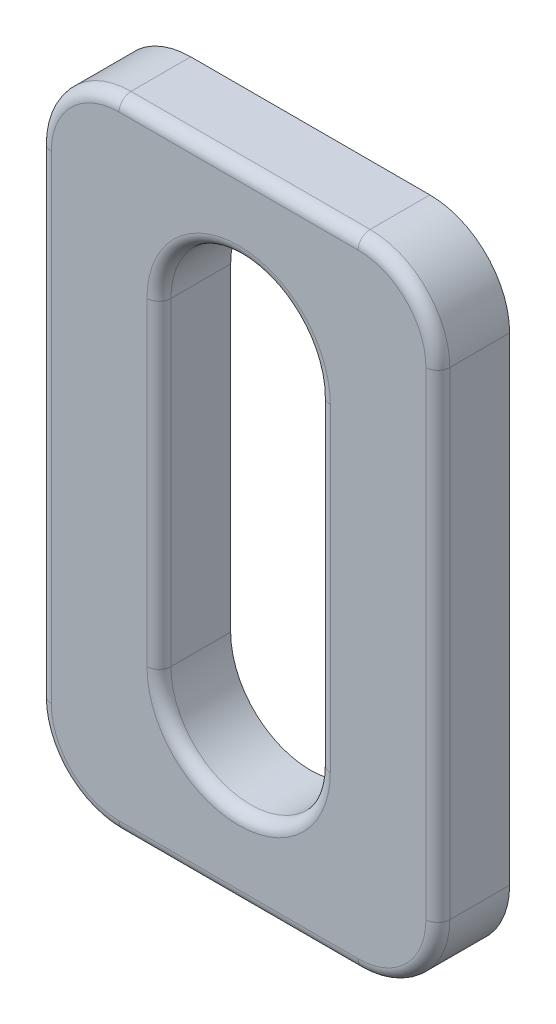
ISO-10303-21;
HEADER;
FILE_DESCRIPTION(('STEP AP214'),'2;1');
FILE_NAME('part.step','',(''),(''),'','','');
FILE_SCHEMA(('AUTOMOTIVE_DESIGN { 1 0 10303 214 1 1 1 1 }'));
ENDSEC;
DATA;
#1=APPLICATION_CONTEXT('core data for automotive mechanical design processes');
#2=APPLICATION_PROTOCOL_DEFINITION('international standard','automotive_design',2000,#1);
#3=PRODUCT_CONTEXT('',#1,'mechanical');
#4=PRODUCT('Part','Part','',(#3));
#5=PRODUCT_RELATED_PRODUCT_CATEGORY('part','',(#4));
#6=PRODUCT_DEFINITION_FORMATION('','',#4);
#7=PRODUCT_DEFINITION_CONTEXT('part definition',#1,'design');
#8=PRODUCT_DEFINITION('design','',#6,#7);
#9=PRODUCT_DEFINITION_SHAPE('','',#8);
#10=(LENGTH_UNIT() NAMED_UNIT(*) SI_UNIT(.MILLI.,.METRE.));
#11=(NAMED_UNIT(*) PLANE_ANGLE_UNIT() SI_UNIT($,.RADIAN.));
#12=(NAMED_UNIT(*) SI_UNIT($,.STERADIAN.) SOLID_ANGLE_UNIT());
#13=UNCERTAINTY_MEASURE_WITH_UNIT(LENGTH_MEASURE(1.E-05),#10,'distance_accuracy_value','');
#14=(GEOMETRIC_REPRESENTATION_CONTEXT(3) GLOBAL_UNCERTAINTY_ASSIGNED_CONTEXT((#13)) GLOBAL_UNIT_ASSIGNED_CONTEXT((#10,
#11,#12)) REPRESENTATION_CONTEXT('',''));
#15=CARTESIAN_POINT('',(0.,0.,0.));
#16=DIRECTION('',(0.,0.,1.));
#17=DIRECTION('',(1.,0.,0.));
#18=AXIS2_PLACEMENT_3D('',#15,#16,#17);
#19=CARTESIAN_POINT('',(0.,0.,4.5));
#20=DIRECTION('',(0.,0.,-1.));
#21=DIRECTION('',(-1.,0.,0.));
#22=AXIS2_PLACEMENT_3D('',#19,#20,#21);
#23=PLANE('',#22);
#24=CARTESIAN_POINT('',(5.,35.,4.5));
#25=DIRECTION('',(0.,0.,-1.));
#26=DIRECTION('',(-1.,0.,0.));
#27=AXIS2_PLACEMENT_3D('',#24,#25,#26);
#28=CIRCLE('',#27,4.25);
#29=CARTESIAN_POINT('',(5.,39.25,4.5));
#30=VERTEX_POINT('',#29);
#31=CARTESIAN_POINT('',(0.75,35.,4.5));
#32=VERTEX_POINT('',#31);
#33=EDGE_CURVE('E256',#30,#32,#28,.F.);
#34=ORIENTED_EDGE('',*,*,#33,.T.);
#35=DIRECTION('',(0.,-1.,0.));
#36=VECTOR('',#35,1.);
#37=CARTESIAN_POINT('',(0.75,0.,4.5));
#38=LINE('',#37,#36);
#39=CARTESIAN_POINT('',(0.75,5.,4.5));
#40=VERTEX_POINT('',#39);
#41=EDGE_CURVE('E258',#32,#40,#38,.T.);
#42=ORIENTED_EDGE('',*,*,#41,.T.);
#43=CARTESIAN_POINT('',(5.,5.,4.5));
#44=DIRECTION('',(0.,0.,-1.));
#45=DIRECTION('',(-1.,0.,0.));
#46=AXIS2_PLACEMENT_3D('',#43,#44,#45);
#47=CIRCLE('',#46,4.25);
#48=CARTESIAN_POINT('',(5.,0.75,4.5));
#49=VERTEX_POINT('',#48);
#50=EDGE_CURVE('E251',#40,#49,#47,.F.);
#51=ORIENTED_EDGE('',*,*,#50,.T.);
#52=DIRECTION('',(1.,0.,0.));
#53=VECTOR('',#52,1.);
#54=CARTESIAN_POINT('',(0.,0.75,4.5));
#55=LINE('',#54,#53);
#56=CARTESIAN_POINT('',(20.,0.75,4.5));
#57=VERTEX_POINT('',#56);
#58=EDGE_CURVE('E243',#49,#57,#55,.T.);
#59=ORIENTED_EDGE('',*,*,#58,.T.);
#60=CARTESIAN_POINT('',(20.,5.,4.5));
#61=DIRECTION('',(0.,0.,-1.));
#62=DIRECTION('',(-1.,0.,0.));
#63=AXIS2_PLACEMENT_3D('',#60,#61,#62);
#64=CIRCLE('',#63,4.25);
#65=CARTESIAN_POINT('',(24.25,5.,4.5));
#66=VERTEX_POINT('',#65);
#67=EDGE_CURVE('E245',#57,#66,#64,.F.);
#68=ORIENTED_EDGE('',*,*,#67,.T.);
#69=DIRECTION('',(0.,1.,0.));
#70=VECTOR('',#69,1.);
#71=CARTESIAN_POINT('',(24.25,0.,4.5));
#72=LINE('',#71,#70);
#73=CARTESIAN_POINT('',(24.25,35.,4.5));
#74=VERTEX_POINT('',#73);
#75=EDGE_CURVE('E247',#66,#74,#72,.T.);
#76=ORIENTED_EDGE('',*,*,#75,.T.);
#77=CARTESIAN_POINT('',(20.,35.,4.5));
#78=DIRECTION('',(0.,0.,-1.));
#79=DIRECTION('',(-1.,0.,0.));
#80=AXIS2_PLACEMENT_3D('',#77,#78,#79);
#81=CIRCLE('',#80,4.25);
#82=CARTESIAN_POINT('',(20.,39.25,4.5));
#83=VERTEX_POINT('',#82);
#84=EDGE_CURVE('E249',#74,#83,#81,.F.);
#85=ORIENTED_EDGE('',*,*,#84,.T.);
#86=DIRECTION('',(-1.,0.,0.));
#87=VECTOR('',#86,1.);
#88=CARTESIAN_POINT('',(0.,39.25,4.5));
#89=LINE('',#88,#87);
#90=EDGE_CURVE('E254',#83,#30,#89,.T.);
#91=ORIENTED_EDGE('',*,*,#90,.T.);
#92=EDGE_LOOP('',(#34,#42,#51,#59,#68,#76,#85,#91));
#93=FACE_BOUND('',#92,.T.);
#94=DIRECTION('',(0.,1.,0.));
#95=VECTOR('',#94,1.);
#96=CARTESIAN_POINT('',(18.25,10.,4.5));
#97=LINE('',#96,#95);
#98=CARTESIAN_POINT('',(18.25,30.,4.5));
#99=VERTEX_POINT('',#98);
#100=CARTESIAN_POINT('',(18.25,10.,4.5));
#101=VERTEX_POINT('',#100);
#102=EDGE_CURVE('E238',#99,#101,#97,.F.);
#103=ORIENTED_EDGE('',*,*,#102,.T.);
#104=CARTESIAN_POINT('',(12.5,10.,4.5));
#105=DIRECTION('',(0.,0.,-1.));
#106=DIRECTION('',(-1.,0.,0.));
#107=AXIS2_PLACEMENT_3D('',#104,#105,#106);
#108=CIRCLE('',#107,5.75);
#109=CARTESIAN_POINT('',(6.75,10.,4.5));
#110=VERTEX_POINT('',#109);
#111=EDGE_CURVE('E240',#101,#110,#108,.T.);
#112=ORIENTED_EDGE('',*,*,#111,.T.);
#113=DIRECTION('',(0.,-1.,0.));
#114=VECTOR('',#113,1.);
#115=CARTESIAN_POINT('',(6.75,30.,4.5));
#116=LINE('',#115,#114);
#117=CARTESIAN_POINT('',(6.75,30.,4.5));
#118=VERTEX_POINT('',#117);
#119=EDGE_CURVE('E234',#110,#118,#116,.F.);
#120=ORIENTED_EDGE('',*,*,#119,.T.);
#121=CARTESIAN_POINT('',(12.5,30.,4.5));
#122=DIRECTION('',(0.,0.,-1.));
#123=DIRECTION('',(-1.,0.,0.));
#124=AXIS2_PLACEMENT_3D('',#121,#122,#123);
#125=CIRCLE('',#124,5.75);
#126=EDGE_CURVE('E236',#118,#99,#125,.T.);
#127=ORIENTED_EDGE('',*,*,#126,.T.);
#128=EDGE_LOOP('',(#103,#112,#120,#127));
#129=FACE_BOUND('',#128,.T.);
#130=ADVANCED_FACE('F35',(#93,#129),#23,.F.);
#131=CARTESIAN_POINT('',(0.,0.,0.));
#132=DIRECTION('',(0.,0.,-1.));
#133=DIRECTION('',(-1.,0.,0.));
#134=AXIS2_PLACEMENT_3D('',#131,#132,#133);
#135=PLANE('',#134);
#136=DIRECTION('',(-1.,0.,0.));
#137=VECTOR('',#136,1.);
#138=CARTESIAN_POINT('',(0.,40.,0.));
#139=LINE('',#138,#137);
#140=CARTESIAN_POINT('',(20.,40.,0.));
#141=VERTEX_POINT('',#140);
#142=CARTESIAN_POINT('',(5.,40.,0.));
#143=VERTEX_POINT('',#142);
#144=EDGE_CURVE('E203',#141,#143,#139,.T.);
#145=ORIENTED_EDGE('',*,*,#144,.F.);
#146=CARTESIAN_POINT('',(20.,35.,0.));
#147=DIRECTION('',(0.,0.,-1.));
#148=DIRECTION('',(-1.,0.,0.));
#149=AXIS2_PLACEMENT_3D('',#146,#147,#148);
#150=CIRCLE('',#149,5.);
#151=CARTESIAN_POINT('',(25.,35.,0.));
#152=VERTEX_POINT('',#151);
#153=EDGE_CURVE('E217',#141,#152,#150,.T.);
#154=ORIENTED_EDGE('',*,*,#153,.T.);
#155=DIRECTION('',(0.,1.,0.));
#156=VECTOR('',#155,1.);
#157=CARTESIAN_POINT('',(25.,0.,0.));
#158=LINE('',#157,#156);
#159=CARTESIAN_POINT('',(25.,5.,0.));
#160=VERTEX_POINT('',#159);
#161=EDGE_CURVE('E200',#160,#152,#158,.T.);
#162=ORIENTED_EDGE('',*,*,#161,.F.);
#163=CARTESIAN_POINT('',(20.,5.,0.));
#164=DIRECTION('',(0.,0.,-1.));
#165=DIRECTION('',(-1.,0.,0.));
#166=AXIS2_PLACEMENT_3D('',#163,#164,#165);
#167=CIRCLE('',#166,5.);
#168=CARTESIAN_POINT('',(20.,0.,0.));
#169=VERTEX_POINT('',#168);
#170=EDGE_CURVE('E215',#160,#169,#167,.T.);
#171=ORIENTED_EDGE('',*,*,#170,.T.);
#172=DIRECTION('',(1.,0.,0.));
#173=VECTOR('',#172,1.);
#174=CARTESIAN_POINT('',(0.,0.,0.));
#175=LINE('',#174,#173);
#176=CARTESIAN_POINT('',(5.,0.,0.));
#177=VERTEX_POINT('',#176);
#178=EDGE_CURVE('E197',#177,#169,#175,.T.);
#179=ORIENTED_EDGE('',*,*,#178,.F.);
#180=CARTESIAN_POINT('',(5.,5.,0.));
#181=DIRECTION('',(0.,0.,-1.));
#182=DIRECTION('',(-1.,0.,0.));
#183=AXIS2_PLACEMENT_3D('',#180,#181,#182);
#184=CIRCLE('',#183,5.);
#185=CARTESIAN_POINT('',(0.,5.,0.));
#186=VERTEX_POINT('',#185);
#187=EDGE_CURVE('E213',#177,#186,#184,.T.);
#188=ORIENTED_EDGE('',*,*,#187,.T.);
#189=DIRECTION('',(0.,-1.,0.));
#190=VECTOR('',#189,1.);
#191=CARTESIAN_POINT('',(0.,0.,0.));
#192=LINE('',#191,#190);
#193=CARTESIAN_POINT('',(0.,35.,0.));
#194=VERTEX_POINT('',#193);
#195=EDGE_CURVE('E167',#194,#186,#192,.T.);
#196=ORIENTED_EDGE('',*,*,#195,.F.);
#197=CARTESIAN_POINT('',(5.,35.,0.));
#198=DIRECTION('',(0.,0.,-1.));
#199=DIRECTION('',(-1.,0.,0.));
#200=AXIS2_PLACEMENT_3D('',#197,#198,#199);
#201=CIRCLE('',#200,5.);
#202=EDGE_CURVE('E211',#194,#143,#201,.T.);
#203=ORIENTED_EDGE('',*,*,#202,.T.);
#204=EDGE_LOOP('',(#145,#154,#162,#171,#179,#188,#196,#203));
#205=FACE_BOUND('',#204,.T.);
#206=DIRECTION('',(0.,1.,0.));
#207=VECTOR('',#206,1.);
#208=CARTESIAN_POINT('',(17.5,30.,0.));
#209=LINE('',#208,#207);
#210=CARTESIAN_POINT('',(17.5,10.,0.));
#211=VERTEX_POINT('',#210);
#212=CARTESIAN_POINT('',(17.5,30.,0.));
#213=VERTEX_POINT('',#212);
#214=EDGE_CURVE('E181',#211,#213,#209,.T.);
#215=ORIENTED_EDGE('',*,*,#214,.T.);
#216=CARTESIAN_POINT('',(12.5,30.,0.));
#217=DIRECTION('',(0.,0.,1.));
#218=DIRECTION('',(1.,0.,0.));
#219=AXIS2_PLACEMENT_3D('',#216,#217,#218);
#220=CIRCLE('',#219,5.);
#221=CARTESIAN_POINT('',(7.5,30.,0.));
#222=VERTEX_POINT('',#221);
#223=EDGE_CURVE('E163',#213,#222,#220,.T.);
#224=ORIENTED_EDGE('',*,*,#223,.T.);
#225=DIRECTION('',(0.,-1.,0.));
#226=VECTOR('',#225,1.);
#227=CARTESIAN_POINT('',(7.5,30.,0.));
#228=LINE('',#227,#226);
#229=CARTESIAN_POINT('',(7.5,10.,0.));
#230=VERTEX_POINT('',#229);
#231=EDGE_CURVE('E171',#222,#230,#228,.T.);
#232=ORIENTED_EDGE('',*,*,#231,.T.);
#233=CARTESIAN_POINT('',(12.5,10.,0.));
#234=DIRECTION('',(0.,0.,1.));
#235=DIRECTION('',(1.,0.,0.));
#236=AXIS2_PLACEMENT_3D('',#233,#234,#235);
#237=CIRCLE('',#236,5.);
#238=EDGE_CURVE('E177',#230,#211,#237,.T.);
#239=ORIENTED_EDGE('',*,*,#238,.T.);
#240=EDGE_LOOP('',(#215,#224,#232,#239));
#241=FACE_BOUND('',#240,.T.);
#242=ADVANCED_FACE('F179',(#205,#241),#135,.T.);
#243=CARTESIAN_POINT('',(0.,0.,4.5));
#244=DIRECTION('',(1.,0.,0.));
#245=DIRECTION('',(0.,0.,-1.));
#246=AXIS2_PLACEMENT_3D('',#243,#244,#245);
#247=PLANE('',#246);
#248=DIRECTION('',(0.,0.,-1.));
#249=VECTOR('',#248,1.);
#250=CARTESIAN_POINT('',(0.,5.,4.5));
#251=LINE('',#250,#249);
#252=CARTESIAN_POINT('',(0.,5.,3.75));
#253=VERTEX_POINT('',#252);
#254=EDGE_CURVE('E231',#186,#253,#251,.F.);
#255=ORIENTED_EDGE('',*,*,#254,.T.);
#256=DIRECTION('',(0.,-1.,0.));
#257=VECTOR('',#256,1.);
#258=CARTESIAN_POINT('',(0.,0.,3.75));
#259=LINE('',#258,#257);
#260=CARTESIAN_POINT('',(0.,35.,3.75));
#261=VERTEX_POINT('',#260);
#262=EDGE_CURVE('E263',#253,#261,#259,.F.);
#263=ORIENTED_EDGE('',*,*,#262,.T.);
#264=DIRECTION('',(0.,0.,-1.));
#265=VECTOR('',#264,1.);
#266=CARTESIAN_POINT('',(0.,35.,4.5));
#267=LINE('',#266,#265);
#268=EDGE_CURVE('E229',#261,#194,#267,.T.);
#269=ORIENTED_EDGE('',*,*,#268,.T.);
#270=ORIENTED_EDGE('',*,*,#195,.T.);
#271=EDGE_LOOP('',(#255,#263,#269,#270));
#272=FACE_BOUND('',#271,.T.);
#273=ADVANCED_FACE('F343',(#272),#247,.F.);
#274=CARTESIAN_POINT('',(0.,0.,4.5));
#275=DIRECTION('',(0.,1.,0.));
#276=DIRECTION('',(0.,0.,1.));
#277=AXIS2_PLACEMENT_3D('',#274,#275,#276);
#278=PLANE('',#277);
#279=DIRECTION('',(0.,0.,-1.));
#280=VECTOR('',#279,1.);
#281=CARTESIAN_POINT('',(20.,0.,4.5));
#282=LINE('',#281,#280);
#283=CARTESIAN_POINT('',(20.,0.,3.75));
#284=VERTEX_POINT('',#283);
#285=EDGE_CURVE('E226',#169,#284,#282,.F.);
#286=ORIENTED_EDGE('',*,*,#285,.T.);
#287=DIRECTION('',(1.,0.,0.));
#288=VECTOR('',#287,1.);
#289=CARTESIAN_POINT('',(0.,0.,3.75));
#290=LINE('',#289,#288);
#291=CARTESIAN_POINT('',(5.,0.,3.75));
#292=VERTEX_POINT('',#291);
#293=EDGE_CURVE('E275',#284,#292,#290,.F.);
#294=ORIENTED_EDGE('',*,*,#293,.T.);
#295=DIRECTION('',(0.,0.,-1.));
#296=VECTOR('',#295,1.);
#297=CARTESIAN_POINT('',(5.,0.,4.5));
#298=LINE('',#297,#296);
#299=EDGE_CURVE('E224',#292,#177,#298,.T.);
#300=ORIENTED_EDGE('',*,*,#299,.T.);
#301=ORIENTED_EDGE('',*,*,#178,.T.);
#302=EDGE_LOOP('',(#286,#294,#300,#301));
#303=FACE_BOUND('',#302,.T.);
#304=ADVANCED_FACE('F356',(#303),#278,.F.);
#305=CARTESIAN_POINT('',(25.,0.,4.5));
#306=DIRECTION('',(-1.,0.,0.));
#307=DIRECTION('',(0.,-1.,0.));
#308=AXIS2_PLACEMENT_3D('',#305,#306,#307);
#309=PLANE('',#308);
#310=DIRECTION('',(0.,0.,-1.));
#311=VECTOR('',#310,1.);
#312=CARTESIAN_POINT('',(25.,35.,4.5));
#313=LINE('',#312,#311);
#314=CARTESIAN_POINT('',(25.,35.,3.75));
#315=VERTEX_POINT('',#314);
#316=EDGE_CURVE('E221',#152,#315,#313,.F.);
#317=ORIENTED_EDGE('',*,*,#316,.T.);
#318=DIRECTION('',(0.,1.,0.));
#319=VECTOR('',#318,1.);
#320=CARTESIAN_POINT('',(25.,0.,3.75));
#321=LINE('',#320,#319);
#322=CARTESIAN_POINT('',(25.,5.,3.75));
#323=VERTEX_POINT('',#322);
#324=EDGE_CURVE('E271',#315,#323,#321,.F.);
#325=ORIENTED_EDGE('',*,*,#324,.T.);
#326=DIRECTION('',(0.,0.,-1.));
#327=VECTOR('',#326,1.);
#328=CARTESIAN_POINT('',(25.,5.,4.5));
#329=LINE('',#328,#327);
#330=EDGE_CURVE('E219',#323,#160,#329,.T.);
#331=ORIENTED_EDGE('',*,*,#330,.T.);
#332=ORIENTED_EDGE('',*,*,#161,.T.);
#333=EDGE_LOOP('',(#317,#325,#331,#332));
#334=FACE_BOUND('',#333,.T.);
#335=ADVANCED_FACE('F352',(#334),#309,.F.);
#336=CARTESIAN_POINT('',(0.,40.,4.5));
#337=DIRECTION('',(0.,-1.,0.));
#338=DIRECTION('',(0.,0.,-1.));
#339=AXIS2_PLACEMENT_3D('',#336,#337,#338);
#340=PLANE('',#339);
#341=DIRECTION('',(0.,0.,-1.));
#342=VECTOR('',#341,1.);
#343=CARTESIAN_POINT('',(5.,40.,4.5));
#344=LINE('',#343,#342);
#345=CARTESIAN_POINT('',(5.,40.,3.75));
#346=VERTEX_POINT('',#345);
#347=EDGE_CURVE('E206',#143,#346,#344,.F.);
#348=ORIENTED_EDGE('',*,*,#347,.T.);
#349=DIRECTION('',(-1.,0.,0.));
#350=VECTOR('',#349,1.);
#351=CARTESIAN_POINT('',(0.,40.,3.75));
#352=LINE('',#351,#350);
#353=CARTESIAN_POINT('',(20.,40.,3.75));
#354=VERTEX_POINT('',#353);
#355=EDGE_CURVE('E269',#346,#354,#352,.F.);
#356=ORIENTED_EDGE('',*,*,#355,.T.);
#357=DIRECTION('',(0.,0.,-1.));
#358=VECTOR('',#357,1.);
#359=CARTESIAN_POINT('',(20.,40.,4.5));
#360=LINE('',#359,#358);
#361=EDGE_CURVE('E209',#354,#141,#360,.T.);
#362=ORIENTED_EDGE('',*,*,#361,.T.);
#363=ORIENTED_EDGE('',*,*,#144,.T.);
#364=EDGE_LOOP('',(#348,#356,#362,#363));
#365=FACE_BOUND('',#364,.T.);
#366=ADVANCED_FACE('F349',(#365),#340,.F.);
#367=CARTESIAN_POINT('',(12.5,30.,4.5));
#368=DIRECTION('',(0.,0.,-1.));
#369=DIRECTION('',(-1.,0.,0.));
#370=AXIS2_PLACEMENT_3D('',#367,#368,#369);
#371=CYLINDRICAL_SURFACE('',#370,5.);
#372=DIRECTION('',(0.,0.,-1.));
#373=VECTOR('',#372,1.);
#374=CARTESIAN_POINT('',(17.5,30.,4.5));
#375=LINE('',#374,#373);
#376=CARTESIAN_POINT('',(17.5,30.,3.75));
#377=VERTEX_POINT('',#376);
#378=EDGE_CURVE('E190',#377,#213,#375,.T.);
#379=ORIENTED_EDGE('',*,*,#378,.F.);
#380=CARTESIAN_POINT('',(12.5,30.,3.75));
#381=DIRECTION('',(0.,0.,-1.));
#382=DIRECTION('',(-1.,0.,0.));
#383=AXIS2_PLACEMENT_3D('',#380,#381,#382);
#384=CIRCLE('',#383,5.);
#385=CARTESIAN_POINT('',(7.5,30.,3.75));
#386=VERTEX_POINT('',#385);
#387=EDGE_CURVE('E44',#377,#386,#384,.F.);
#388=ORIENTED_EDGE('',*,*,#387,.T.);
#389=DIRECTION('',(0.,0.,-1.));
#390=VECTOR('',#389,1.);
#391=CARTESIAN_POINT('',(7.5,30.,4.5));
#392=LINE('',#391,#390);
#393=EDGE_CURVE('E159',#386,#222,#392,.T.);
#394=ORIENTED_EDGE('',*,*,#393,.T.);
#395=ORIENTED_EDGE('',*,*,#223,.F.);
#396=EDGE_LOOP('',(#379,#388,#394,#395));
#397=FACE_BOUND('',#396,.T.);
#398=ADVANCED_FACE('F161',(#397),#371,.F.);
#399=CARTESIAN_POINT('',(7.5,30.,4.5));
#400=DIRECTION('',(1.,0.,0.));
#401=DIRECTION('',(0.,1.,0.));
#402=AXIS2_PLACEMENT_3D('',#399,#400,#401);
#403=PLANE('',#402);
#404=ORIENTED_EDGE('',*,*,#393,.F.);
#405=DIRECTION('',(0.,-1.,0.));
#406=VECTOR('',#405,1.);
#407=CARTESIAN_POINT('',(7.5,10.,3.75));
#408=LINE('',#407,#406);
#409=CARTESIAN_POINT('',(7.5,10.,3.75));
#410=VERTEX_POINT('',#409);
#411=EDGE_CURVE('E11',#386,#410,#408,.T.);
#412=ORIENTED_EDGE('',*,*,#411,.T.);
#413=DIRECTION('',(0.,0.,-1.));
#414=VECTOR('',#413,1.);
#415=CARTESIAN_POINT('',(7.5,10.,4.5));
#416=LINE('',#415,#414);
#417=EDGE_CURVE('E168',#410,#230,#416,.T.);
#418=ORIENTED_EDGE('',*,*,#417,.T.);
#419=ORIENTED_EDGE('',*,*,#231,.F.);
#420=EDGE_LOOP('',(#404,#412,#418,#419));
#421=FACE_BOUND('',#420,.T.);
#422=ADVANCED_FACE('F172',(#421),#403,.T.);
#423=CARTESIAN_POINT('',(12.5,10.,4.5));
#424=DIRECTION('',(0.,0.,-1.));
#425=DIRECTION('',(-1.,0.,0.));
#426=AXIS2_PLACEMENT_3D('',#423,#424,#425);
#427=CYLINDRICAL_SURFACE('',#426,5.);
#428=ORIENTED_EDGE('',*,*,#417,.F.);
#429=CARTESIAN_POINT('',(12.5,10.,3.75));
#430=DIRECTION('',(0.,0.,-1.));
#431=DIRECTION('',(-1.,0.,0.));
#432=AXIS2_PLACEMENT_3D('',#429,#430,#431);
#433=CIRCLE('',#432,5.);
#434=CARTESIAN_POINT('',(17.5,10.,3.75));
#435=VERTEX_POINT('',#434);
#436=EDGE_CURVE('E277',#410,#435,#433,.F.);
#437=ORIENTED_EDGE('',*,*,#436,.T.);
#438=DIRECTION('',(0.,0.,-1.));
#439=VECTOR('',#438,1.);
#440=CARTESIAN_POINT('',(17.5,10.,4.5));
#441=LINE('',#440,#439);
#442=EDGE_CURVE('E192',#435,#211,#441,.T.);
#443=ORIENTED_EDGE('',*,*,#442,.T.);
#444=ORIENTED_EDGE('',*,*,#238,.F.);
#445=EDGE_LOOP('',(#428,#437,#443,#444));
#446=FACE_BOUND('',#445,.T.);
#447=ADVANCED_FACE('F324',(#446),#427,.F.);
#448=CARTESIAN_POINT('',(17.5,30.,4.5));
#449=DIRECTION('',(-1.,0.,0.));
#450=DIRECTION('',(0.,-1.,0.));
#451=AXIS2_PLACEMENT_3D('',#448,#449,#450);
#452=PLANE('',#451);
#453=ORIENTED_EDGE('',*,*,#442,.F.);
#454=DIRECTION('',(0.,1.,0.));
#455=VECTOR('',#454,1.);
#456=CARTESIAN_POINT('',(17.5,30.,3.75));
#457=LINE('',#456,#455);
#458=EDGE_CURVE('E59',#435,#377,#457,.T.);
#459=ORIENTED_EDGE('',*,*,#458,.T.);
#460=ORIENTED_EDGE('',*,*,#378,.T.);
#461=ORIENTED_EDGE('',*,*,#214,.F.);
#462=EDGE_LOOP('',(#453,#459,#460,#461));
#463=FACE_BOUND('',#462,.T.);
#464=ADVANCED_FACE('F325',(#463),#452,.T.);
#465=CARTESIAN_POINT('',(20.,35.,4.5));
#466=DIRECTION('',(0.,0.,-1.));
#467=DIRECTION('',(-1.,0.,0.));
#468=AXIS2_PLACEMENT_3D('',#465,#466,#467);
#469=CYLINDRICAL_SURFACE('',#468,5.);
#470=ORIENTED_EDGE('',*,*,#361,.F.);
#471=CARTESIAN_POINT('',(20.,35.,3.75));
#472=DIRECTION('',(0.,0.,-1.));
#473=DIRECTION('',(-1.,0.,0.));
#474=AXIS2_PLACEMENT_3D('',#471,#472,#473);
#475=CIRCLE('',#474,5.);
#476=EDGE_CURVE('E267',#354,#315,#475,.T.);
#477=ORIENTED_EDGE('',*,*,#476,.T.);
#478=ORIENTED_EDGE('',*,*,#316,.F.);
#479=ORIENTED_EDGE('',*,*,#153,.F.);
#480=EDGE_LOOP('',(#470,#477,#478,#479));
#481=FACE_BOUND('',#480,.T.);
#482=ADVANCED_FACE('F327',(#481),#469,.T.);
#483=CARTESIAN_POINT('',(20.,5.,4.5));
#484=DIRECTION('',(0.,0.,-1.));
#485=DIRECTION('',(-1.,0.,0.));
#486=AXIS2_PLACEMENT_3D('',#483,#484,#485);
#487=CYLINDRICAL_SURFACE('',#486,5.);
#488=ORIENTED_EDGE('',*,*,#330,.F.);
#489=CARTESIAN_POINT('',(20.,5.,3.75));
#490=DIRECTION('',(0.,0.,-1.));
#491=DIRECTION('',(-1.,0.,0.));
#492=AXIS2_PLACEMENT_3D('',#489,#490,#491);
#493=CIRCLE('',#492,5.);
#494=EDGE_CURVE('E273',#323,#284,#493,.T.);
#495=ORIENTED_EDGE('',*,*,#494,.T.);
#496=ORIENTED_EDGE('',*,*,#285,.F.);
#497=ORIENTED_EDGE('',*,*,#170,.F.);
#498=EDGE_LOOP('',(#488,#495,#496,#497));
#499=FACE_BOUND('',#498,.T.);
#500=ADVANCED_FACE('F333',(#499),#487,.T.);
#501=CARTESIAN_POINT('',(5.,5.,4.5));
#502=DIRECTION('',(0.,0.,-1.));
#503=DIRECTION('',(-1.,0.,0.));
#504=AXIS2_PLACEMENT_3D('',#501,#502,#503);
#505=CYLINDRICAL_SURFACE('',#504,5.);
#506=ORIENTED_EDGE('',*,*,#299,.F.);
#507=CARTESIAN_POINT('',(5.,5.,3.75));
#508=DIRECTION('',(0.,0.,-1.));
#509=DIRECTION('',(-1.,0.,0.));
#510=AXIS2_PLACEMENT_3D('',#507,#508,#509);
#511=CIRCLE('',#510,5.);
#512=EDGE_CURVE('E260',#292,#253,#511,.T.);
#513=ORIENTED_EDGE('',*,*,#512,.T.);
#514=ORIENTED_EDGE('',*,*,#254,.F.);
#515=ORIENTED_EDGE('',*,*,#187,.F.);
#516=EDGE_LOOP('',(#506,#513,#514,#515));
#517=FACE_BOUND('',#516,.T.);
#518=ADVANCED_FACE('F366',(#517),#505,.T.);
#519=CARTESIAN_POINT('',(5.,35.,4.5));
#520=DIRECTION('',(0.,0.,-1.));
#521=DIRECTION('',(-1.,0.,0.));
#522=AXIS2_PLACEMENT_3D('',#519,#520,#521);
#523=CYLINDRICAL_SURFACE('',#522,5.);
#524=ORIENTED_EDGE('',*,*,#268,.F.);
#525=CARTESIAN_POINT('',(5.,35.,3.75));
#526=DIRECTION('',(0.,0.,-1.));
#527=DIRECTION('',(-1.,0.,0.));
#528=AXIS2_PLACEMENT_3D('',#525,#526,#527);
#529=CIRCLE('',#528,5.);
#530=EDGE_CURVE('E265',#261,#346,#529,.T.);
#531=ORIENTED_EDGE('',*,*,#530,.T.);
#532=ORIENTED_EDGE('',*,*,#347,.F.);
#533=ORIENTED_EDGE('',*,*,#202,.F.);
#534=EDGE_LOOP('',(#524,#531,#532,#533));
#535=FACE_BOUND('',#534,.T.);
#536=ADVANCED_FACE('F370',(#535),#523,.T.);
#537=CARTESIAN_POINT('',(20.,35.,3.75));
#538=DIRECTION('',(0.,0.,-1.));
#539=DIRECTION('',(-1.,0.,0.));
#540=AXIS2_PLACEMENT_3D('',#537,#538,#539);
#541=TOROIDAL_SURFACE('',#540,4.25,0.75);
#542=CARTESIAN_POINT('',(24.25,35.,3.75));
#543=DIRECTION('',(0.,-1.,0.));
#544=DIRECTION('',(0.,0.,-1.));
#545=AXIS2_PLACEMENT_3D('',#542,#543,#544);
#546=CIRCLE('',#545,0.75);
#547=EDGE_CURVE('E185',#315,#74,#546,.T.);
#548=ORIENTED_EDGE('',*,*,#547,.F.);
#549=ORIENTED_EDGE('',*,*,#476,.F.);
#550=CARTESIAN_POINT('',(20.,39.25,3.75));
#551=DIRECTION('',(-1.,0.,0.));
#552=DIRECTION('',(0.,0.,1.));
#553=AXIS2_PLACEMENT_3D('',#550,#551,#552);
#554=CIRCLE('',#553,0.75);
#555=EDGE_CURVE('E182',#83,#354,#554,.T.);
#556=ORIENTED_EDGE('',*,*,#555,.F.);
#557=ORIENTED_EDGE('',*,*,#84,.F.);
#558=EDGE_LOOP('',(#548,#549,#556,#557));
#559=FACE_BOUND('',#558,.T.);
#560=ADVANCED_FACE('F374',(#559),#541,.T.);
#561=CARTESIAN_POINT('',(0.,39.25,3.75));
#562=DIRECTION('',(-1.,0.,0.));
#563=DIRECTION('',(0.,0.,1.));
#564=AXIS2_PLACEMENT_3D('',#561,#562,#563);
#565=CYLINDRICAL_SURFACE('',#564,0.75);
#566=ORIENTED_EDGE('',*,*,#555,.T.);
#567=ORIENTED_EDGE('',*,*,#355,.F.);
#568=CARTESIAN_POINT('',(5.,39.25,3.75));
#569=DIRECTION('',(-1.,0.,0.));
#570=DIRECTION('',(0.,0.,1.));
#571=AXIS2_PLACEMENT_3D('',#568,#569,#570);
#572=CIRCLE('',#571,0.75);
#573=EDGE_CURVE('E295',#30,#346,#572,.T.);
#574=ORIENTED_EDGE('',*,*,#573,.F.);
#575=ORIENTED_EDGE('',*,*,#90,.F.);
#576=EDGE_LOOP('',(#566,#567,#574,#575));
#577=FACE_BOUND('',#576,.T.);
#578=ADVANCED_FACE('F399',(#577),#565,.T.);
#579=CARTESIAN_POINT('',(24.25,0.,3.75));
#580=DIRECTION('',(0.,1.,0.));
#581=DIRECTION('',(-1.,0.,0.));
#582=AXIS2_PLACEMENT_3D('',#579,#580,#581);
#583=CYLINDRICAL_SURFACE('',#582,0.75);
#584=ORIENTED_EDGE('',*,*,#547,.T.);
#585=ORIENTED_EDGE('',*,*,#75,.F.);
#586=CARTESIAN_POINT('',(24.25,5.,3.75));
#587=DIRECTION('',(0.,-1.,0.));
#588=DIRECTION('',(0.,0.,-1.));
#589=AXIS2_PLACEMENT_3D('',#586,#587,#588);
#590=CIRCLE('',#589,0.75);
#591=EDGE_CURVE('E292',#323,#66,#590,.T.);
#592=ORIENTED_EDGE('',*,*,#591,.F.);
#593=ORIENTED_EDGE('',*,*,#324,.F.);
#594=EDGE_LOOP('',(#584,#585,#592,#593));
#595=FACE_BOUND('',#594,.T.);
#596=ADVANCED_FACE('F395',(#595),#583,.T.);
#597=CARTESIAN_POINT('',(5.,35.,3.75));
#598=DIRECTION('',(0.,0.,-1.));
#599=DIRECTION('',(-1.,0.,0.));
#600=AXIS2_PLACEMENT_3D('',#597,#598,#599);
#601=TOROIDAL_SURFACE('',#600,4.25,0.75);
#602=ORIENTED_EDGE('',*,*,#573,.T.);
#603=ORIENTED_EDGE('',*,*,#530,.F.);
#604=CARTESIAN_POINT('',(0.75,35.,3.75));
#605=DIRECTION('',(0.,-1.,0.));
#606=DIRECTION('',(0.,0.,-1.));
#607=AXIS2_PLACEMENT_3D('',#604,#605,#606);
#608=CIRCLE('',#607,0.75);
#609=EDGE_CURVE('E289',#32,#261,#608,.T.);
#610=ORIENTED_EDGE('',*,*,#609,.F.);
#611=ORIENTED_EDGE('',*,*,#33,.F.);
#612=EDGE_LOOP('',(#602,#603,#610,#611));
#613=FACE_BOUND('',#612,.T.);
#614=ADVANCED_FACE('F391',(#613),#601,.T.);
#615=CARTESIAN_POINT('',(20.,5.,3.75));
#616=DIRECTION('',(0.,0.,-1.));
#617=DIRECTION('',(-1.,0.,0.));
#618=AXIS2_PLACEMENT_3D('',#615,#616,#617);
#619=TOROIDAL_SURFACE('',#618,4.25,0.75);
#620=ORIENTED_EDGE('',*,*,#591,.T.);
#621=ORIENTED_EDGE('',*,*,#67,.F.);
#622=CARTESIAN_POINT('',(20.,0.75,3.75));
#623=DIRECTION('',(-1.,0.,0.));
#624=DIRECTION('',(0.,0.,1.));
#625=AXIS2_PLACEMENT_3D('',#622,#623,#624);
#626=CIRCLE('',#625,0.75);
#627=EDGE_CURVE('E286',#284,#57,#626,.T.);
#628=ORIENTED_EDGE('',*,*,#627,.F.);
#629=ORIENTED_EDGE('',*,*,#494,.F.);
#630=EDGE_LOOP('',(#620,#621,#628,#629));
#631=FACE_BOUND('',#630,.T.);
#632=ADVANCED_FACE('F387',(#631),#619,.T.);
#633=CARTESIAN_POINT('',(0.75,0.,3.75));
#634=DIRECTION('',(0.,-1.,0.));
#635=DIRECTION('',(0.,0.,-1.));
#636=AXIS2_PLACEMENT_3D('',#633,#634,#635);
#637=CYLINDRICAL_SURFACE('',#636,0.75);
#638=ORIENTED_EDGE('',*,*,#609,.T.);
#639=ORIENTED_EDGE('',*,*,#262,.F.);
#640=CARTESIAN_POINT('',(0.75,5.,3.75));
#641=DIRECTION('',(0.,-1.,0.));
#642=DIRECTION('',(0.,0.,-1.));
#643=AXIS2_PLACEMENT_3D('',#640,#641,#642);
#644=CIRCLE('',#643,0.75);
#645=EDGE_CURVE('E284',#40,#253,#644,.T.);
#646=ORIENTED_EDGE('',*,*,#645,.F.);
#647=ORIENTED_EDGE('',*,*,#41,.F.);
#648=EDGE_LOOP('',(#638,#639,#646,#647));
#649=FACE_BOUND('',#648,.T.);
#650=ADVANCED_FACE('F383',(#649),#637,.T.);
#651=CARTESIAN_POINT('',(0.,0.75,3.75));
#652=DIRECTION('',(1.,0.,0.));
#653=DIRECTION('',(0.,0.,-1.));
#654=AXIS2_PLACEMENT_3D('',#651,#652,#653);
#655=CYLINDRICAL_SURFACE('',#654,0.75);
#656=ORIENTED_EDGE('',*,*,#627,.T.);
#657=ORIENTED_EDGE('',*,*,#58,.F.);
#658=CARTESIAN_POINT('',(5.,0.75,3.75));
#659=DIRECTION('',(-1.,0.,0.));
#660=DIRECTION('',(0.,0.,1.));
#661=AXIS2_PLACEMENT_3D('',#658,#659,#660);
#662=CIRCLE('',#661,0.75);
#663=EDGE_CURVE('E282',#292,#49,#662,.T.);
#664=ORIENTED_EDGE('',*,*,#663,.F.);
#665=ORIENTED_EDGE('',*,*,#293,.F.);
#666=EDGE_LOOP('',(#656,#657,#664,#665));
#667=FACE_BOUND('',#666,.T.);
#668=ADVANCED_FACE('F379',(#667),#655,.T.);
#669=CARTESIAN_POINT('',(5.,5.,3.75));
#670=DIRECTION('',(0.,0.,-1.));
#671=DIRECTION('',(-1.,0.,0.));
#672=AXIS2_PLACEMENT_3D('',#669,#670,#671);
#673=TOROIDAL_SURFACE('',#672,4.25,0.75);
#674=ORIENTED_EDGE('',*,*,#645,.T.);
#675=ORIENTED_EDGE('',*,*,#512,.F.);
#676=ORIENTED_EDGE('',*,*,#663,.T.);
#677=ORIENTED_EDGE('',*,*,#50,.F.);
#678=EDGE_LOOP('',(#674,#675,#676,#677));
#679=FACE_BOUND('',#678,.T.);
#680=ADVANCED_FACE('F376',(#679),#673,.T.);
#681=CARTESIAN_POINT('',(12.5,30.,3.75));
#682=DIRECTION('',(0.,0.,-1.));
#683=DIRECTION('',(-1.,0.,0.));
#684=AXIS2_PLACEMENT_3D('',#681,#682,#683);
#685=TOROIDAL_SURFACE('',#684,5.75,0.75);
#686=CARTESIAN_POINT('',(18.25,30.,3.75));
#687=DIRECTION('',(0.,-1.,0.));
#688=DIRECTION('',(0.,0.,-1.));
#689=AXIS2_PLACEMENT_3D('',#686,#687,#688);
#690=CIRCLE('',#689,0.75);
#691=EDGE_CURVE('E303',#99,#377,#690,.T.);
#692=ORIENTED_EDGE('',*,*,#691,.F.);
#693=ORIENTED_EDGE('',*,*,#126,.F.);
#694=CARTESIAN_POINT('',(6.75,30.,3.75));
#695=DIRECTION('',(0.,-1.,0.));
#696=DIRECTION('',(0.,0.,-1.));
#697=AXIS2_PLACEMENT_3D('',#694,#695,#696);
#698=CIRCLE('',#697,0.75);
#699=EDGE_CURVE('E39',#386,#118,#698,.T.);
#700=ORIENTED_EDGE('',*,*,#699,.F.);
#701=ORIENTED_EDGE('',*,*,#387,.F.);
#702=EDGE_LOOP('',(#692,#693,#700,#701));
#703=FACE_BOUND('',#702,.T.);
#704=ADVANCED_FACE('F37',(#703),#685,.T.);
#705=CARTESIAN_POINT('',(6.75,30.,3.75));
#706=DIRECTION('',(0.,1.,0.));
#707=DIRECTION('',(-1.,0.,0.));
#708=AXIS2_PLACEMENT_3D('',#705,#706,#707);
#709=CYLINDRICAL_SURFACE('',#708,0.75);
#710=ORIENTED_EDGE('',*,*,#699,.T.);
#711=ORIENTED_EDGE('',*,*,#119,.F.);
#712=CARTESIAN_POINT('',(6.75,10.,3.75));
#713=DIRECTION('',(0.,-1.,0.));
#714=DIRECTION('',(0.,0.,-1.));
#715=AXIS2_PLACEMENT_3D('',#712,#713,#714);
#716=CIRCLE('',#715,0.75);
#717=EDGE_CURVE('E302',#410,#110,#716,.T.);
#718=ORIENTED_EDGE('',*,*,#717,.F.);
#719=ORIENTED_EDGE('',*,*,#411,.F.);
#720=EDGE_LOOP('',(#710,#711,#718,#719));
#721=FACE_BOUND('',#720,.T.);
#722=ADVANCED_FACE('F312',(#721),#709,.T.);
#723=CARTESIAN_POINT('',(18.25,30.,3.75));
#724=DIRECTION('',(0.,-1.,0.));
#725=DIRECTION('',(1.,0.,0.));
#726=AXIS2_PLACEMENT_3D('',#723,#724,#725);
#727=CYLINDRICAL_SURFACE('',#726,0.75);
#728=ORIENTED_EDGE('',*,*,#691,.T.);
#729=ORIENTED_EDGE('',*,*,#458,.F.);
#730=CARTESIAN_POINT('',(18.25,10.,3.75));
#731=DIRECTION('',(0.,-1.,0.));
#732=DIRECTION('',(0.,0.,-1.));
#733=AXIS2_PLACEMENT_3D('',#730,#731,#732);
#734=CIRCLE('',#733,0.75);
#735=EDGE_CURVE('E300',#101,#435,#734,.T.);
#736=ORIENTED_EDGE('',*,*,#735,.F.);
#737=ORIENTED_EDGE('',*,*,#102,.F.);
#738=EDGE_LOOP('',(#728,#729,#736,#737));
#739=FACE_BOUND('',#738,.T.);
#740=ADVANCED_FACE('F322',(#739),#727,.T.);
#741=CARTESIAN_POINT('',(12.5,10.,3.75));
#742=DIRECTION('',(0.,0.,-1.));
#743=DIRECTION('',(-1.,0.,0.));
#744=AXIS2_PLACEMENT_3D('',#741,#742,#743);
#745=TOROIDAL_SURFACE('',#744,5.75,0.75);
#746=ORIENTED_EDGE('',*,*,#717,.T.);
#747=ORIENTED_EDGE('',*,*,#111,.F.);
#748=ORIENTED_EDGE('',*,*,#735,.T.);
#749=ORIENTED_EDGE('',*,*,#436,.F.);
#750=EDGE_LOOP('',(#746,#747,#748,#749));
#751=FACE_BOUND('',#750,.T.);
#752=ADVANCED_FACE('F320',(#751),#745,.T.);
#753=CLOSED_SHELL('',(#130,#242,#273,#304,#335,#366,#398,#422,#447,#464,#482,#500,#518,#536,
#560,#578,#596,#614,#632,#650,#668,#680,#704,#722,#740,#752));
#754=MANIFOLD_SOLID_BREP('B2',#753);
#755=ADVANCED_BREP_SHAPE_REPRESENTATION('',(#18,#754),#14);
#756=SHAPE_DEFINITION_REPRESENTATION(#9,#755);
ENDSEC;
END-ISO-10303-21;
